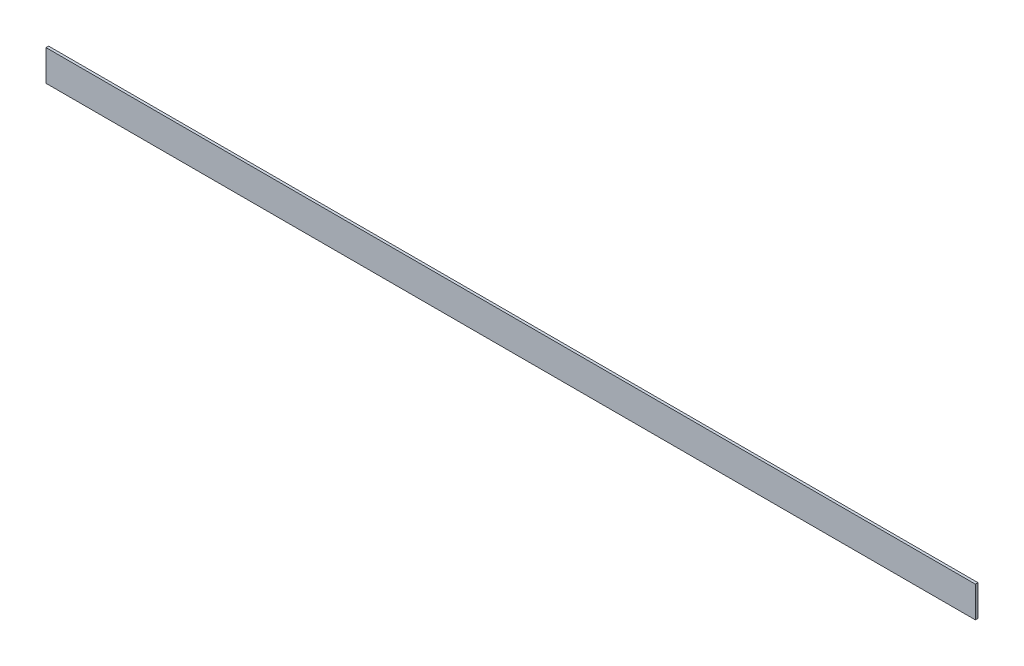
ISO-10303-21;
HEADER;
FILE_DESCRIPTION(('STEP AP214'),'2;1');
FILE_NAME('part.step','',(''),(''),'','','');
FILE_SCHEMA(('AUTOMOTIVE_DESIGN { 1 0 10303 214 1 1 1 1 }'));
ENDSEC;
DATA;
#1=APPLICATION_CONTEXT('core data for automotive mechanical design processes');
#2=APPLICATION_PROTOCOL_DEFINITION('international standard','automotive_design',2000,#1);
#3=PRODUCT_CONTEXT('',#1,'mechanical');
#4=PRODUCT('Part','Part','',(#3));
#5=PRODUCT_RELATED_PRODUCT_CATEGORY('part','',(#4));
#6=PRODUCT_DEFINITION_FORMATION('','',#4);
#7=PRODUCT_DEFINITION_CONTEXT('part definition',#1,'design');
#8=PRODUCT_DEFINITION('design','',#6,#7);
#9=PRODUCT_DEFINITION_SHAPE('','',#8);
#10=(LENGTH_UNIT() NAMED_UNIT(*) SI_UNIT(.MILLI.,.METRE.));
#11=(NAMED_UNIT(*) PLANE_ANGLE_UNIT() SI_UNIT($,.RADIAN.));
#12=(NAMED_UNIT(*) SI_UNIT($,.STERADIAN.) SOLID_ANGLE_UNIT());
#13=UNCERTAINTY_MEASURE_WITH_UNIT(LENGTH_MEASURE(1.E-05),#10,'distance_accuracy_value','');
#14=(GEOMETRIC_REPRESENTATION_CONTEXT(3) GLOBAL_UNCERTAINTY_ASSIGNED_CONTEXT((#13)) GLOBAL_UNIT_ASSIGNED_CONTEXT((#10,
#11,#12)) REPRESENTATION_CONTEXT('',''));
#15=CARTESIAN_POINT('',(0.,0.,0.));
#16=DIRECTION('',(0.,0.,1.));
#17=DIRECTION('',(1.,0.,0.));
#18=AXIS2_PLACEMENT_3D('',#15,#16,#17);
#19=CARTESIAN_POINT('',(0.,0.,1.));
#20=DIRECTION('',(1.,0.,0.));
#21=DIRECTION('',(0.,0.,-1.));
#22=AXIS2_PLACEMENT_3D('',#19,#20,#21);
#23=PLANE('',#22);
#24=DIRECTION('',(0.,-1.,0.));
#25=VECTOR('',#24,1.);
#26=CARTESIAN_POINT('',(0.,0.,0.));
#27=LINE('',#26,#25);
#28=CARTESIAN_POINT('',(0.,12.,0.));
#29=VERTEX_POINT('',#28);
#30=CARTESIAN_POINT('',(0.,0.,0.));
#31=VERTEX_POINT('',#30);
#32=EDGE_CURVE('E100',#29,#31,#27,.T.);
#33=ORIENTED_EDGE('',*,*,#32,.T.);
#34=DIRECTION('',(0.,0.,-1.));
#35=VECTOR('',#34,1.);
#36=CARTESIAN_POINT('',(0.,0.,1.));
#37=LINE('',#36,#35);
#38=CARTESIAN_POINT('',(0.,0.,1.));
#39=VERTEX_POINT('',#38);
#40=EDGE_CURVE('E11',#39,#31,#37,.T.);
#41=ORIENTED_EDGE('',*,*,#40,.F.);
#42=DIRECTION('',(0.,-1.,0.));
#43=VECTOR('',#42,1.);
#44=CARTESIAN_POINT('',(0.,0.,1.));
#45=LINE('',#44,#43);
#46=CARTESIAN_POINT('',(0.,12.,1.));
#47=VERTEX_POINT('',#46);
#48=EDGE_CURVE('E88',#47,#39,#45,.T.);
#49=ORIENTED_EDGE('',*,*,#48,.F.);
#50=DIRECTION('',(0.,0.,-1.));
#51=VECTOR('',#50,1.);
#52=CARTESIAN_POINT('',(0.,12.,1.));
#53=LINE('',#52,#51);
#54=EDGE_CURVE('E96',#47,#29,#53,.T.);
#55=ORIENTED_EDGE('',*,*,#54,.T.);
#56=EDGE_LOOP('',(#33,#41,#49,#55));
#57=FACE_BOUND('',#56,.T.);
#58=ADVANCED_FACE('F37',(#57),#23,.F.);
#59=CARTESIAN_POINT('',(0.,0.,1.));
#60=DIRECTION('',(0.,1.,0.));
#61=DIRECTION('',(0.,0.,1.));
#62=AXIS2_PLACEMENT_3D('',#59,#60,#61);
#63=PLANE('',#62);
#64=DIRECTION('',(1.,0.,0.));
#65=VECTOR('',#64,1.);
#66=CARTESIAN_POINT('',(0.,0.,0.));
#67=LINE('',#66,#65);
#68=CARTESIAN_POINT('',(360.,0.,0.));
#69=VERTEX_POINT('',#68);
#70=EDGE_CURVE('E92',#31,#69,#67,.T.);
#71=ORIENTED_EDGE('',*,*,#70,.T.);
#72=DIRECTION('',(0.,0.,-1.));
#73=VECTOR('',#72,1.);
#74=CARTESIAN_POINT('',(360.,0.,1.));
#75=LINE('',#74,#73);
#76=CARTESIAN_POINT('',(360.,0.,1.));
#77=VERTEX_POINT('',#76);
#78=EDGE_CURVE('E45',#77,#69,#75,.T.);
#79=ORIENTED_EDGE('',*,*,#78,.F.);
#80=DIRECTION('',(1.,0.,0.));
#81=VECTOR('',#80,1.);
#82=CARTESIAN_POINT('',(0.,0.,1.));
#83=LINE('',#82,#81);
#84=EDGE_CURVE('E83',#39,#77,#83,.T.);
#85=ORIENTED_EDGE('',*,*,#84,.F.);
#86=ORIENTED_EDGE('',*,*,#40,.T.);
#87=EDGE_LOOP('',(#71,#79,#85,#86));
#88=FACE_BOUND('',#87,.T.);
#89=ADVANCED_FACE('F91',(#88),#63,.F.);
#90=CARTESIAN_POINT('',(360.,0.,1.));
#91=DIRECTION('',(-1.,0.,0.));
#92=DIRECTION('',(0.,0.,1.));
#93=AXIS2_PLACEMENT_3D('',#90,#91,#92);
#94=PLANE('',#93);
#95=DIRECTION('',(0.,1.,0.));
#96=VECTOR('',#95,1.);
#97=CARTESIAN_POINT('',(360.,0.,0.));
#98=LINE('',#97,#96);
#99=CARTESIAN_POINT('',(360.,12.,0.));
#100=VERTEX_POINT('',#99);
#101=EDGE_CURVE('E70',#69,#100,#98,.T.);
#102=ORIENTED_EDGE('',*,*,#101,.T.);
#103=DIRECTION('',(0.,0.,-1.));
#104=VECTOR('',#103,1.);
#105=CARTESIAN_POINT('',(360.,12.,1.));
#106=LINE('',#105,#104);
#107=CARTESIAN_POINT('',(360.,12.,1.));
#108=VERTEX_POINT('',#107);
#109=EDGE_CURVE('E93',#108,#100,#106,.T.);
#110=ORIENTED_EDGE('',*,*,#109,.F.);
#111=DIRECTION('',(0.,1.,0.));
#112=VECTOR('',#111,1.);
#113=CARTESIAN_POINT('',(360.,0.,1.));
#114=LINE('',#113,#112);
#115=EDGE_CURVE('E86',#77,#108,#114,.T.);
#116=ORIENTED_EDGE('',*,*,#115,.F.);
#117=ORIENTED_EDGE('',*,*,#78,.T.);
#118=EDGE_LOOP('',(#102,#110,#116,#117));
#119=FACE_BOUND('',#118,.T.);
#120=ADVANCED_FACE('F94',(#119),#94,.F.);
#121=CARTESIAN_POINT('',(0.,12.,1.));
#122=DIRECTION('',(0.,-1.,0.));
#123=DIRECTION('',(1.,0.,0.));
#124=AXIS2_PLACEMENT_3D('',#121,#122,#123);
#125=PLANE('',#124);
#126=DIRECTION('',(-1.,0.,0.));
#127=VECTOR('',#126,1.);
#128=CARTESIAN_POINT('',(0.,12.,0.));
#129=LINE('',#128,#127);
#130=EDGE_CURVE('E76',#100,#29,#129,.T.);
#131=ORIENTED_EDGE('',*,*,#130,.T.);
#132=ORIENTED_EDGE('',*,*,#54,.F.);
#133=DIRECTION('',(-1.,0.,0.));
#134=VECTOR('',#133,1.);
#135=CARTESIAN_POINT('',(0.,12.,1.));
#136=LINE('',#135,#134);
#137=EDGE_CURVE('E53',#108,#47,#136,.T.);
#138=ORIENTED_EDGE('',*,*,#137,.F.);
#139=ORIENTED_EDGE('',*,*,#109,.T.);
#140=EDGE_LOOP('',(#131,#132,#138,#139));
#141=FACE_BOUND('',#140,.T.);
#142=ADVANCED_FACE('F107',(#141),#125,.F.);
#143=CARTESIAN_POINT('',(0.,0.,1.));
#144=DIRECTION('',(0.,0.,-1.));
#145=DIRECTION('',(-1.,0.,0.));
#146=AXIS2_PLACEMENT_3D('',#143,#144,#145);
#147=PLANE('',#146);
#148=ORIENTED_EDGE('',*,*,#48,.T.);
#149=ORIENTED_EDGE('',*,*,#84,.T.);
#150=ORIENTED_EDGE('',*,*,#115,.T.);
#151=ORIENTED_EDGE('',*,*,#137,.T.);
#152=EDGE_LOOP('',(#148,#149,#150,#151));
#153=FACE_BOUND('',#152,.T.);
#154=ADVANCED_FACE('F84',(#153),#147,.F.);
#155=CARTESIAN_POINT('',(0.,0.,0.));
#156=DIRECTION('',(0.,0.,-1.));
#157=DIRECTION('',(-1.,0.,0.));
#158=AXIS2_PLACEMENT_3D('',#155,#156,#157);
#159=PLANE('',#158);
#160=ORIENTED_EDGE('',*,*,#32,.F.);
#161=ORIENTED_EDGE('',*,*,#130,.F.);
#162=ORIENTED_EDGE('',*,*,#101,.F.);
#163=ORIENTED_EDGE('',*,*,#70,.F.);
#164=EDGE_LOOP('',(#160,#161,#162,#163));
#165=FACE_BOUND('',#164,.T.);
#166=ADVANCED_FACE('F110',(#165),#159,.T.);
#167=CLOSED_SHELL('',(#58,#89,#120,#142,#154,#166));
#168=MANIFOLD_SOLID_BREP('B2',#167);
#169=ADVANCED_BREP_SHAPE_REPRESENTATION('',(#18,#168),#14);
#170=SHAPE_DEFINITION_REPRESENTATION(#9,#169);
ENDSEC;
END-ISO-10303-21;
